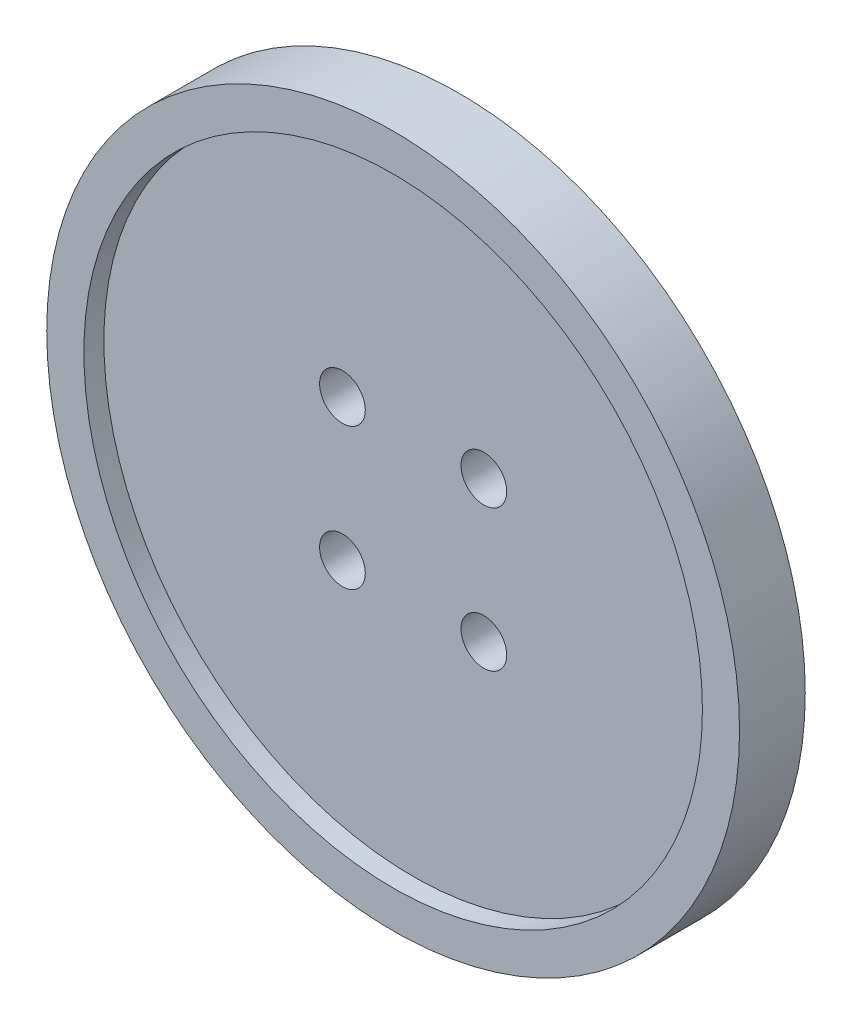
ISO-10303-21;
HEADER;
FILE_DESCRIPTION(('STEP AP214'),'2;1');
FILE_NAME('part.step','',(''),(''),'','','');
FILE_SCHEMA(('AUTOMOTIVE_DESIGN { 1 0 10303 214 1 1 1 1 }'));
ENDSEC;
DATA;
#1=APPLICATION_CONTEXT('core data for automotive mechanical design processes');
#2=APPLICATION_PROTOCOL_DEFINITION('international standard','automotive_design',2000,#1);
#3=PRODUCT_CONTEXT('',#1,'mechanical');
#4=PRODUCT('Part','Part','',(#3));
#5=PRODUCT_RELATED_PRODUCT_CATEGORY('part','',(#4));
#6=PRODUCT_DEFINITION_FORMATION('','',#4);
#7=PRODUCT_DEFINITION_CONTEXT('part definition',#1,'design');
#8=PRODUCT_DEFINITION('design','',#6,#7);
#9=PRODUCT_DEFINITION_SHAPE('','',#8);
#10=(LENGTH_UNIT() NAMED_UNIT(*) SI_UNIT(.MILLI.,.METRE.));
#11=(NAMED_UNIT(*) PLANE_ANGLE_UNIT() SI_UNIT($,.RADIAN.));
#12=(NAMED_UNIT(*) SI_UNIT($,.STERADIAN.) SOLID_ANGLE_UNIT());
#13=UNCERTAINTY_MEASURE_WITH_UNIT(LENGTH_MEASURE(1.E-05),#10,'distance_accuracy_value','');
#14=(GEOMETRIC_REPRESENTATION_CONTEXT(3) GLOBAL_UNCERTAINTY_ASSIGNED_CONTEXT((#13)) GLOBAL_UNIT_ASSIGNED_CONTEXT((#10,
#11,#12)) REPRESENTATION_CONTEXT('',''));
#15=CARTESIAN_POINT('',(0.,0.,0.));
#16=DIRECTION('',(0.,0.,1.));
#17=DIRECTION('',(1.,0.,0.));
#18=AXIS2_PLACEMENT_3D('',#15,#16,#17);
#19=CARTESIAN_POINT('',(-4.94974746830583,4.94974746830583,4.6));
#20=DIRECTION('',(0.,0.,-1.));
#21=DIRECTION('',(-1.,0.,0.));
#22=AXIS2_PLACEMENT_3D('',#19,#20,#21);
#23=CYLINDRICAL_SURFACE('',#22,1.6);
#24=CARTESIAN_POINT('',(-4.94974746830583,4.94974746830583,0.));
#25=DIRECTION('',(0.,0.,1.));
#26=DIRECTION('',(1.,0.,0.));
#27=AXIS2_PLACEMENT_3D('',#24,#25,#26);
#28=CIRCLE('',#27,1.6);
#29=CARTESIAN_POINT('',(-3.34974746830583,4.94974746830583,0.));
#30=VERTEX_POINT('',#29);
#31=EDGE_CURVE('E44',#30,#30,#28,.T.);
#32=ORIENTED_EDGE('',*,*,#31,.F.);
#33=EDGE_LOOP('',(#32));
#34=FACE_BOUND('',#33,.T.);
#35=CARTESIAN_POINT('',(-4.94974746830583,4.94974746830583,3.2));
#36=DIRECTION('',(0.,0.,1.));
#37=DIRECTION('',(1.,0.,0.));
#38=AXIS2_PLACEMENT_3D('',#35,#36,#37);
#39=CIRCLE('',#38,1.6);
#40=CARTESIAN_POINT('',(-3.34974746830583,4.94974746830583,3.2));
#41=VERTEX_POINT('',#40);
#42=EDGE_CURVE('E57',#41,#41,#39,.T.);
#43=ORIENTED_EDGE('',*,*,#42,.T.);
#44=EDGE_LOOP('',(#43));
#45=FACE_BOUND('',#44,.T.);
#46=ADVANCED_FACE('F31',(#34,#45),#23,.F.);
#47=CARTESIAN_POINT('',(4.94974746830583,4.94974746830583,4.6));
#48=DIRECTION('',(0.,0.,-1.));
#49=DIRECTION('',(-1.,0.,0.));
#50=AXIS2_PLACEMENT_3D('',#47,#48,#49);
#51=CYLINDRICAL_SURFACE('',#50,1.6);
#52=CARTESIAN_POINT('',(4.94974746830583,4.94974746830583,0.));
#53=DIRECTION('',(0.,0.,1.));
#54=DIRECTION('',(1.,0.,0.));
#55=AXIS2_PLACEMENT_3D('',#52,#53,#54);
#56=CIRCLE('',#55,1.6);
#57=CARTESIAN_POINT('',(6.54974746830583,4.94974746830583,0.));
#58=VERTEX_POINT('',#57);
#59=EDGE_CURVE('E48',#58,#58,#56,.T.);
#60=ORIENTED_EDGE('',*,*,#59,.F.);
#61=EDGE_LOOP('',(#60));
#62=FACE_BOUND('',#61,.T.);
#63=CARTESIAN_POINT('',(4.94974746830583,4.94974746830583,3.2));
#64=DIRECTION('',(0.,0.,1.));
#65=DIRECTION('',(1.,0.,0.));
#66=AXIS2_PLACEMENT_3D('',#63,#64,#65);
#67=CIRCLE('',#66,1.6);
#68=CARTESIAN_POINT('',(6.54974746830583,4.94974746830583,3.2));
#69=VERTEX_POINT('',#68);
#70=EDGE_CURVE('E60',#69,#69,#67,.T.);
#71=ORIENTED_EDGE('',*,*,#70,.T.);
#72=EDGE_LOOP('',(#71));
#73=FACE_BOUND('',#72,.T.);
#74=ADVANCED_FACE('F91',(#62,#73),#51,.F.);
#75=CARTESIAN_POINT('',(4.94974746830583,-4.94974746830583,4.6));
#76=DIRECTION('',(0.,0.,-1.));
#77=DIRECTION('',(-1.,0.,0.));
#78=AXIS2_PLACEMENT_3D('',#75,#76,#77);
#79=CYLINDRICAL_SURFACE('',#78,1.6);
#80=CARTESIAN_POINT('',(4.94974746830583,-4.94974746830583,0.));
#81=DIRECTION('',(0.,0.,1.));
#82=DIRECTION('',(1.,0.,0.));
#83=AXIS2_PLACEMENT_3D('',#80,#81,#82);
#84=CIRCLE('',#83,1.6);
#85=CARTESIAN_POINT('',(6.54974746830583,-4.94974746830583,0.));
#86=VERTEX_POINT('',#85);
#87=EDGE_CURVE('E51',#86,#86,#84,.T.);
#88=ORIENTED_EDGE('',*,*,#87,.F.);
#89=EDGE_LOOP('',(#88));
#90=FACE_BOUND('',#89,.T.);
#91=CARTESIAN_POINT('',(4.94974746830583,-4.94974746830583,3.2));
#92=DIRECTION('',(0.,0.,1.));
#93=DIRECTION('',(1.,0.,0.));
#94=AXIS2_PLACEMENT_3D('',#91,#92,#93);
#95=CIRCLE('',#94,1.6);
#96=CARTESIAN_POINT('',(6.54974746830583,-4.94974746830583,3.2));
#97=VERTEX_POINT('',#96);
#98=EDGE_CURVE('E63',#97,#97,#95,.T.);
#99=ORIENTED_EDGE('',*,*,#98,.T.);
#100=EDGE_LOOP('',(#99));
#101=FACE_BOUND('',#100,.T.);
#102=ADVANCED_FACE('F97',(#90,#101),#79,.F.);
#103=CARTESIAN_POINT('',(-4.94974746830583,-4.94974746830583,4.6));
#104=DIRECTION('',(0.,0.,-1.));
#105=DIRECTION('',(-1.,0.,0.));
#106=AXIS2_PLACEMENT_3D('',#103,#104,#105);
#107=CYLINDRICAL_SURFACE('',#106,1.6);
#108=CARTESIAN_POINT('',(-4.94974746830583,-4.94974746830583,0.));
#109=DIRECTION('',(0.,0.,1.));
#110=DIRECTION('',(1.,0.,0.));
#111=AXIS2_PLACEMENT_3D('',#108,#109,#110);
#112=CIRCLE('',#111,1.6);
#113=CARTESIAN_POINT('',(-3.34974746830583,-4.94974746830583,0.));
#114=VERTEX_POINT('',#113);
#115=EDGE_CURVE('E54',#114,#114,#112,.T.);
#116=ORIENTED_EDGE('',*,*,#115,.F.);
#117=EDGE_LOOP('',(#116));
#118=FACE_BOUND('',#117,.T.);
#119=CARTESIAN_POINT('',(-4.94974746830583,-4.94974746830583,3.2));
#120=DIRECTION('',(0.,0.,1.));
#121=DIRECTION('',(1.,0.,0.));
#122=AXIS2_PLACEMENT_3D('',#119,#120,#121);
#123=CIRCLE('',#122,1.6);
#124=CARTESIAN_POINT('',(-3.34974746830583,-4.94974746830583,3.2));
#125=VERTEX_POINT('',#124);
#126=EDGE_CURVE('E35',#125,#125,#123,.T.);
#127=ORIENTED_EDGE('',*,*,#126,.T.);
#128=EDGE_LOOP('',(#127));
#129=FACE_BOUND('',#128,.T.);
#130=ADVANCED_FACE('F76',(#118,#129),#107,.F.);
#131=CARTESIAN_POINT('',(0.,0.,4.6));
#132=DIRECTION('',(0.,0.,1.));
#133=DIRECTION('',(1.,0.,0.));
#134=AXIS2_PLACEMENT_3D('',#131,#132,#133);
#135=PLANE('',#134);
#136=CARTESIAN_POINT('',(0.,0.,4.6));
#137=DIRECTION('',(0.,0.,1.));
#138=DIRECTION('',(1.,0.,0.));
#139=AXIS2_PLACEMENT_3D('',#136,#137,#138);
#140=CIRCLE('',#139,21.65);
#141=CARTESIAN_POINT('',(21.65,0.,4.6));
#142=VERTEX_POINT('',#141);
#143=EDGE_CURVE('E66',#142,#142,#140,.T.);
#144=ORIENTED_EDGE('',*,*,#143,.F.);
#145=EDGE_LOOP('',(#144));
#146=FACE_BOUND('',#145,.T.);
#147=CARTESIAN_POINT('',(0.,0.,4.6));
#148=DIRECTION('',(0.,0.,1.));
#149=DIRECTION('',(1.,0.,0.));
#150=AXIS2_PLACEMENT_3D('',#147,#148,#149);
#151=CIRCLE('',#150,24.25);
#152=CARTESIAN_POINT('',(24.25,0.,4.6));
#153=VERTEX_POINT('',#152);
#154=EDGE_CURVE('E10',#153,#153,#151,.T.);
#155=ORIENTED_EDGE('',*,*,#154,.T.);
#156=EDGE_LOOP('',(#155));
#157=FACE_BOUND('',#156,.T.);
#158=ADVANCED_FACE('F104',(#146,#157),#135,.T.);
#159=CARTESIAN_POINT('',(0.,0.,0.));
#160=DIRECTION('',(0.,0.,1.));
#161=DIRECTION('',(1.,0.,0.));
#162=AXIS2_PLACEMENT_3D('',#159,#160,#161);
#163=PLANE('',#162);
#164=CARTESIAN_POINT('',(0.,0.,0.));
#165=DIRECTION('',(0.,0.,1.));
#166=DIRECTION('',(1.,0.,0.));
#167=AXIS2_PLACEMENT_3D('',#164,#165,#166);
#168=CIRCLE('',#167,24.25);
#169=CARTESIAN_POINT('',(24.25,0.,0.));
#170=VERTEX_POINT('',#169);
#171=EDGE_CURVE('E39',#170,#170,#168,.T.);
#172=ORIENTED_EDGE('',*,*,#171,.F.);
#173=EDGE_LOOP('',(#172));
#174=FACE_BOUND('',#173,.T.);
#175=ORIENTED_EDGE('',*,*,#31,.T.);
#176=EDGE_LOOP('',(#175));
#177=FACE_BOUND('',#176,.T.);
#178=ORIENTED_EDGE('',*,*,#59,.T.);
#179=EDGE_LOOP('',(#178));
#180=FACE_BOUND('',#179,.T.);
#181=ORIENTED_EDGE('',*,*,#87,.T.);
#182=EDGE_LOOP('',(#181));
#183=FACE_BOUND('',#182,.T.);
#184=ORIENTED_EDGE('',*,*,#115,.T.);
#185=EDGE_LOOP('',(#184));
#186=FACE_BOUND('',#185,.T.);
#187=ADVANCED_FACE('F106',(#174,#177,#180,#183,#186),#163,.F.);
#188=CARTESIAN_POINT('',(0.,0.,4.6));
#189=DIRECTION('',(0.,0.,-1.));
#190=DIRECTION('',(-1.,0.,0.));
#191=AXIS2_PLACEMENT_3D('',#188,#189,#190);
#192=CYLINDRICAL_SURFACE('',#191,24.25);
#193=ORIENTED_EDGE('',*,*,#154,.F.);
#194=EDGE_LOOP('',(#193));
#195=FACE_BOUND('',#194,.T.);
#196=ORIENTED_EDGE('',*,*,#171,.T.);
#197=EDGE_LOOP('',(#196));
#198=FACE_BOUND('',#197,.T.);
#199=ADVANCED_FACE('F33',(#195,#198),#192,.T.);
#200=CARTESIAN_POINT('',(0.,0.,3.2));
#201=DIRECTION('',(0.,0.,1.));
#202=DIRECTION('',(1.,0.,0.));
#203=AXIS2_PLACEMENT_3D('',#200,#201,#202);
#204=CYLINDRICAL_SURFACE('',#203,21.65);
#205=CARTESIAN_POINT('',(0.,0.,3.2));
#206=DIRECTION('',(0.,0.,1.));
#207=DIRECTION('',(1.,0.,0.));
#208=AXIS2_PLACEMENT_3D('',#205,#206,#207);
#209=CIRCLE('',#208,21.65);
#210=CARTESIAN_POINT('',(21.65,0.,3.2));
#211=VERTEX_POINT('',#210);
#212=EDGE_CURVE('E69',#211,#211,#209,.T.);
#213=ORIENTED_EDGE('',*,*,#212,.F.);
#214=EDGE_LOOP('',(#213));
#215=FACE_BOUND('',#214,.T.);
#216=ORIENTED_EDGE('',*,*,#143,.T.);
#217=EDGE_LOOP('',(#216));
#218=FACE_BOUND('',#217,.T.);
#219=ADVANCED_FACE('F80',(#215,#218),#204,.F.);
#220=CARTESIAN_POINT('',(0.,0.,3.2));
#221=DIRECTION('',(0.,0.,1.));
#222=DIRECTION('',(1.,0.,0.));
#223=AXIS2_PLACEMENT_3D('',#220,#221,#222);
#224=PLANE('',#223);
#225=ORIENTED_EDGE('',*,*,#42,.F.);
#226=EDGE_LOOP('',(#225));
#227=FACE_BOUND('',#226,.T.);
#228=ORIENTED_EDGE('',*,*,#70,.F.);
#229=EDGE_LOOP('',(#228));
#230=FACE_BOUND('',#229,.T.);
#231=ORIENTED_EDGE('',*,*,#98,.F.);
#232=EDGE_LOOP('',(#231));
#233=FACE_BOUND('',#232,.T.);
#234=ORIENTED_EDGE('',*,*,#126,.F.);
#235=EDGE_LOOP('',(#234));
#236=FACE_BOUND('',#235,.T.);
#237=ORIENTED_EDGE('',*,*,#212,.T.);
#238=EDGE_LOOP('',(#237));
#239=FACE_BOUND('',#238,.T.);
#240=ADVANCED_FACE('F78',(#227,#230,#233,#236,#239),#224,.T.);
#241=CLOSED_SHELL('',(#46,#74,#102,#130,#158,#187,#199,#219,#240));
#242=MANIFOLD_SOLID_BREP('B2',#241);
#243=ADVANCED_BREP_SHAPE_REPRESENTATION('',(#18,#242),#14);
#244=SHAPE_DEFINITION_REPRESENTATION(#9,#243);
ENDSEC;
END-ISO-10303-21;
